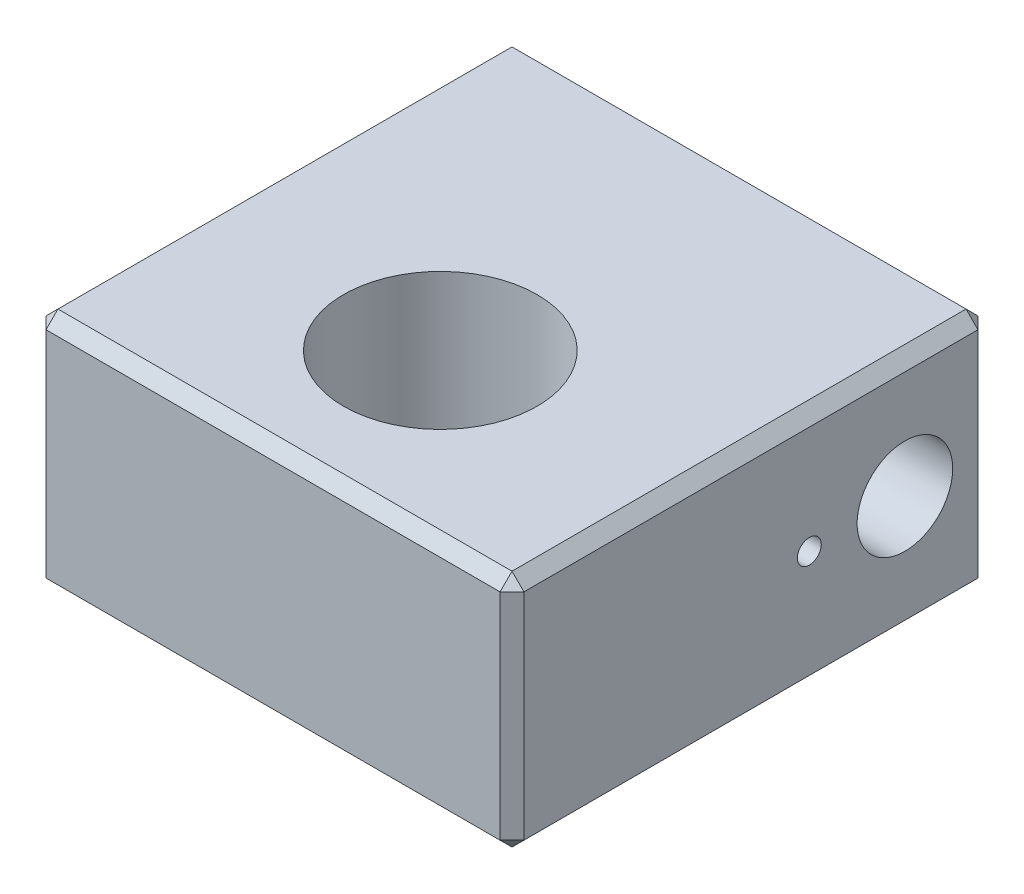
ISO-10303-21;
HEADER;
FILE_DESCRIPTION(('STEP AP214'),'2;1');
FILE_NAME('part.step','',(''),(''),'','','');
FILE_SCHEMA(('AUTOMOTIVE_DESIGN { 1 0 10303 214 1 1 1 1 }'));
ENDSEC;
DATA;
#1=APPLICATION_CONTEXT('core data for automotive mechanical design processes');
#2=APPLICATION_PROTOCOL_DEFINITION('international standard','automotive_design',2000,#1);
#3=PRODUCT_CONTEXT('',#1,'mechanical');
#4=PRODUCT('Part','Part','',(#3));
#5=PRODUCT_RELATED_PRODUCT_CATEGORY('part','',(#4));
#6=PRODUCT_DEFINITION_FORMATION('','',#4);
#7=PRODUCT_DEFINITION_CONTEXT('part definition',#1,'design');
#8=PRODUCT_DEFINITION('design','',#6,#7);
#9=PRODUCT_DEFINITION_SHAPE('','',#8);
#10=(LENGTH_UNIT() NAMED_UNIT(*) SI_UNIT(.MILLI.,.METRE.));
#11=(NAMED_UNIT(*) PLANE_ANGLE_UNIT() SI_UNIT($,.RADIAN.));
#12=(NAMED_UNIT(*) SI_UNIT($,.STERADIAN.) SOLID_ANGLE_UNIT());
#13=UNCERTAINTY_MEASURE_WITH_UNIT(LENGTH_MEASURE(1.E-05),#10,'distance_accuracy_value','');
#14=(GEOMETRIC_REPRESENTATION_CONTEXT(3) GLOBAL_UNCERTAINTY_ASSIGNED_CONTEXT((#13)) GLOBAL_UNIT_ASSIGNED_CONTEXT((#10,
#11,#12)) REPRESENTATION_CONTEXT('',''));
#15=CARTESIAN_POINT('',(0.,0.,0.));
#16=DIRECTION('',(0.,0.,1.));
#17=DIRECTION('',(1.,0.,0.));
#18=AXIS2_PLACEMENT_3D('',#15,#16,#17);
#19=CARTESIAN_POINT('',(10.,5.,-10.));
#20=DIRECTION('',(-1.,0.,0.));
#21=DIRECTION('',(0.,0.,1.));
#22=AXIS2_PLACEMENT_3D('',#19,#20,#21);
#23=PLANE('',#22);
#24=DIRECTION('',(0.,0.,-1.));
#25=VECTOR('',#24,1.);
#26=CARTESIAN_POINT('',(10.,-4.5,-10.));
#27=LINE('',#26,#25);
#28=CARTESIAN_POINT('',(10.,-4.5,9.5));
#29=VERTEX_POINT('',#28);
#30=CARTESIAN_POINT('',(10.,-4.5,-9.49999999999999));
#31=VERTEX_POINT('',#30);
#32=EDGE_CURVE('E180',#29,#31,#27,.T.);
#33=ORIENTED_EDGE('',*,*,#32,.T.);
#34=DIRECTION('',(0.,1.,0.));
#35=VECTOR('',#34,1.);
#36=CARTESIAN_POINT('',(10.,5.,-9.49999999999999));
#37=LINE('',#36,#35);
#38=CARTESIAN_POINT('',(10.,4.5,-9.49999999999999));
#39=VERTEX_POINT('',#38);
#40=EDGE_CURVE('E182',#31,#39,#37,.T.);
#41=ORIENTED_EDGE('',*,*,#40,.T.);
#42=DIRECTION('',(0.,0.,1.));
#43=VECTOR('',#42,1.);
#44=CARTESIAN_POINT('',(10.,4.5,10.));
#45=LINE('',#44,#43);
#46=CARTESIAN_POINT('',(10.,4.5,9.5));
#47=VERTEX_POINT('',#46);
#48=EDGE_CURVE('E176',#39,#47,#45,.T.);
#49=ORIENTED_EDGE('',*,*,#48,.T.);
#50=DIRECTION('',(0.,-1.,0.));
#51=VECTOR('',#50,1.);
#52=CARTESIAN_POINT('',(10.,5.,9.5));
#53=LINE('',#52,#51);
#54=EDGE_CURVE('E178',#47,#29,#53,.T.);
#55=ORIENTED_EDGE('',*,*,#54,.T.);
#56=EDGE_LOOP('',(#33,#41,#49,#55));
#57=FACE_BOUND('',#56,.T.);
#58=CARTESIAN_POINT('',(10.,0.,-2.44209004934981));
#59=DIRECTION('',(1.,0.,0.));
#60=DIRECTION('',(0.,0.,-1.));
#61=AXIS2_PLACEMENT_3D('',#58,#59,#60);
#62=CIRCLE('',#61,0.5);
#63=CARTESIAN_POINT('',(10.,0.,-2.94209004934981));
#64=VERTEX_POINT('',#63);
#65=EDGE_CURVE('E255',#64,#64,#62,.T.);
#66=ORIENTED_EDGE('',*,*,#65,.F.);
#67=EDGE_LOOP('',(#66));
#68=FACE_BOUND('',#67,.T.);
#69=CARTESIAN_POINT('',(10.,0.,-6.44209004934981));
#70=DIRECTION('',(1.,0.,0.));
#71=DIRECTION('',(0.,0.,-1.));
#72=AXIS2_PLACEMENT_3D('',#69,#70,#71);
#73=CIRCLE('',#72,2.);
#74=CARTESIAN_POINT('',(10.,0.,-8.44209004934981));
#75=VERTEX_POINT('',#74);
#76=EDGE_CURVE('E267',#75,#75,#73,.T.);
#77=ORIENTED_EDGE('',*,*,#76,.F.);
#78=EDGE_LOOP('',(#77));
#79=FACE_BOUND('',#78,.T.);
#80=ADVANCED_FACE('F34',(#57,#68,#79),#23,.F.);
#81=CARTESIAN_POINT('',(-10.,5.,-10.));
#82=DIRECTION('',(0.,0.,1.));
#83=DIRECTION('',(1.,0.,0.));
#84=AXIS2_PLACEMENT_3D('',#81,#82,#83);
#85=PLANE('',#84);
#86=DIRECTION('',(-1.,0.,0.));
#87=VECTOR('',#86,1.);
#88=CARTESIAN_POINT('',(-10.,-4.5,-10.));
#89=LINE('',#88,#87);
#90=CARTESIAN_POINT('',(9.5,-4.5,-10.));
#91=VERTEX_POINT('',#90);
#92=CARTESIAN_POINT('',(-9.5,-4.5,-10.));
#93=VERTEX_POINT('',#92);
#94=EDGE_CURVE('E171',#91,#93,#89,.T.);
#95=ORIENTED_EDGE('',*,*,#94,.T.);
#96=DIRECTION('',(0.,1.,0.));
#97=VECTOR('',#96,1.);
#98=CARTESIAN_POINT('',(-9.5,5.,-10.));
#99=LINE('',#98,#97);
#100=CARTESIAN_POINT('',(-9.5,4.5,-10.));
#101=VERTEX_POINT('',#100);
#102=EDGE_CURVE('E173',#93,#101,#99,.T.);
#103=ORIENTED_EDGE('',*,*,#102,.T.);
#104=DIRECTION('',(1.,0.,0.));
#105=VECTOR('',#104,1.);
#106=CARTESIAN_POINT('',(10.,4.5,-10.));
#107=LINE('',#106,#105);
#108=CARTESIAN_POINT('',(9.5,4.5,-10.));
#109=VERTEX_POINT('',#108);
#110=EDGE_CURVE('E167',#101,#109,#107,.T.);
#111=ORIENTED_EDGE('',*,*,#110,.T.);
#112=DIRECTION('',(0.,-1.,0.));
#113=VECTOR('',#112,1.);
#114=CARTESIAN_POINT('',(9.5,5.,-10.));
#115=LINE('',#114,#113);
#116=EDGE_CURVE('E169',#109,#91,#115,.T.);
#117=ORIENTED_EDGE('',*,*,#116,.T.);
#118=EDGE_LOOP('',(#95,#103,#111,#117));
#119=FACE_BOUND('',#118,.T.);
#120=ADVANCED_FACE('F330',(#119),#85,.F.);
#121=CARTESIAN_POINT('',(-10.,5.,-10.));
#122=DIRECTION('',(1.,0.,0.));
#123=DIRECTION('',(0.,0.,-1.));
#124=AXIS2_PLACEMENT_3D('',#121,#122,#123);
#125=PLANE('',#124);
#126=DIRECTION('',(0.,-1.,0.));
#127=VECTOR('',#126,1.);
#128=CARTESIAN_POINT('',(-10.,5.,-9.5));
#129=LINE('',#128,#127);
#130=CARTESIAN_POINT('',(-10.,4.5,-9.5));
#131=VERTEX_POINT('',#130);
#132=CARTESIAN_POINT('',(-10.,-4.5,-9.5));
#133=VERTEX_POINT('',#132);
#134=EDGE_CURVE('E154',#131,#133,#129,.T.);
#135=ORIENTED_EDGE('',*,*,#134,.T.);
#136=DIRECTION('',(0.,0.,1.));
#137=VECTOR('',#136,1.);
#138=CARTESIAN_POINT('',(-10.,-4.5,-10.));
#139=LINE('',#138,#137);
#140=CARTESIAN_POINT('',(-10.,-4.5,9.5));
#141=VERTEX_POINT('',#140);
#142=EDGE_CURVE('E129',#133,#141,#139,.T.);
#143=ORIENTED_EDGE('',*,*,#142,.T.);
#144=DIRECTION('',(0.,1.,0.));
#145=VECTOR('',#144,1.);
#146=CARTESIAN_POINT('',(-10.,5.,9.5));
#147=LINE('',#146,#145);
#148=CARTESIAN_POINT('',(-10.,4.5,9.5));
#149=VERTEX_POINT('',#148);
#150=EDGE_CURVE('E142',#141,#149,#147,.T.);
#151=ORIENTED_EDGE('',*,*,#150,.T.);
#152=DIRECTION('',(0.,0.,-1.));
#153=VECTOR('',#152,1.);
#154=CARTESIAN_POINT('',(-10.,4.5,-10.));
#155=LINE('',#154,#153);
#156=EDGE_CURVE('E148',#149,#131,#155,.T.);
#157=ORIENTED_EDGE('',*,*,#156,.T.);
#158=EDGE_LOOP('',(#135,#143,#151,#157));
#159=FACE_BOUND('',#158,.T.);
#160=CARTESIAN_POINT('',(-10.,0.,-6.44209004934981));
#161=DIRECTION('',(1.,0.,0.));
#162=DIRECTION('',(0.,0.,-1.));
#163=AXIS2_PLACEMENT_3D('',#160,#161,#162);
#164=CIRCLE('',#163,2.);
#165=CARTESIAN_POINT('',(-10.,0.,-8.44209004934981));
#166=VERTEX_POINT('',#165);
#167=EDGE_CURVE('E270',#166,#166,#164,.T.);
#168=ORIENTED_EDGE('',*,*,#167,.T.);
#169=EDGE_LOOP('',(#168));
#170=FACE_BOUND('',#169,.T.);
#171=ADVANCED_FACE('F151',(#159,#170),#125,.F.);
#172=CARTESIAN_POINT('',(-10.,5.,10.));
#173=DIRECTION('',(0.,0.,-1.));
#174=DIRECTION('',(-1.,0.,0.));
#175=AXIS2_PLACEMENT_3D('',#172,#173,#174);
#176=PLANE('',#175);
#177=DIRECTION('',(-1.,0.,0.));
#178=VECTOR('',#177,1.);
#179=CARTESIAN_POINT('',(-10.,4.5,10.));
#180=LINE('',#179,#178);
#181=CARTESIAN_POINT('',(9.5,4.5,10.));
#182=VERTEX_POINT('',#181);
#183=CARTESIAN_POINT('',(-9.5,4.5,10.));
#184=VERTEX_POINT('',#183);
#185=EDGE_CURVE('E194',#182,#184,#180,.T.);
#186=ORIENTED_EDGE('',*,*,#185,.T.);
#187=DIRECTION('',(0.,-1.,0.));
#188=VECTOR('',#187,1.);
#189=CARTESIAN_POINT('',(-9.5,5.,10.));
#190=LINE('',#189,#188);
#191=CARTESIAN_POINT('',(-9.5,-4.5,10.));
#192=VERTEX_POINT('',#191);
#193=EDGE_CURVE('E11',#184,#192,#190,.T.);
#194=ORIENTED_EDGE('',*,*,#193,.T.);
#195=DIRECTION('',(1.,0.,0.));
#196=VECTOR('',#195,1.);
#197=CARTESIAN_POINT('',(-10.,-4.5,10.));
#198=LINE('',#197,#196);
#199=CARTESIAN_POINT('',(9.5,-4.5,10.));
#200=VERTEX_POINT('',#199);
#201=EDGE_CURVE('E43',#192,#200,#198,.T.);
#202=ORIENTED_EDGE('',*,*,#201,.T.);
#203=DIRECTION('',(0.,1.,0.));
#204=VECTOR('',#203,1.);
#205=CARTESIAN_POINT('',(9.5,5.,10.));
#206=LINE('',#205,#204);
#207=EDGE_CURVE('E196',#200,#182,#206,.T.);
#208=ORIENTED_EDGE('',*,*,#207,.T.);
#209=EDGE_LOOP('',(#186,#194,#202,#208));
#210=FACE_BOUND('',#209,.T.);
#211=ADVANCED_FACE('F310',(#210),#176,.F.);
#212=CARTESIAN_POINT('',(0.,5.,0.));
#213=DIRECTION('',(0.,1.,0.));
#214=DIRECTION('',(0.,0.,1.));
#215=AXIS2_PLACEMENT_3D('',#212,#213,#214);
#216=PLANE('',#215);
#217=DIRECTION('',(0.,0.,-1.));
#218=VECTOR('',#217,1.);
#219=CARTESIAN_POINT('',(9.5,5.,-10.));
#220=LINE('',#219,#218);
#221=CARTESIAN_POINT('',(9.5,5.,9.5));
#222=VERTEX_POINT('',#221);
#223=CARTESIAN_POINT('',(9.5,5.,-9.5));
#224=VERTEX_POINT('',#223);
#225=EDGE_CURVE('E185',#222,#224,#220,.T.);
#226=ORIENTED_EDGE('',*,*,#225,.T.);
#227=DIRECTION('',(-1.,0.,0.));
#228=VECTOR('',#227,1.);
#229=CARTESIAN_POINT('',(-10.,5.,-9.5));
#230=LINE('',#229,#228);
#231=CARTESIAN_POINT('',(-9.5,5.,-9.5));
#232=VERTEX_POINT('',#231);
#233=EDGE_CURVE('E191',#224,#232,#230,.T.);
#234=ORIENTED_EDGE('',*,*,#233,.T.);
#235=DIRECTION('',(0.,0.,1.));
#236=VECTOR('',#235,1.);
#237=CARTESIAN_POINT('',(-9.5,5.,10.));
#238=LINE('',#237,#236);
#239=CARTESIAN_POINT('',(-9.5,5.,9.5));
#240=VERTEX_POINT('',#239);
#241=EDGE_CURVE('E189',#232,#240,#238,.T.);
#242=ORIENTED_EDGE('',*,*,#241,.T.);
#243=DIRECTION('',(1.,0.,0.));
#244=VECTOR('',#243,1.);
#245=CARTESIAN_POINT('',(10.,5.,9.5));
#246=LINE('',#245,#244);
#247=EDGE_CURVE('E187',#240,#222,#246,.T.);
#248=ORIENTED_EDGE('',*,*,#247,.T.);
#249=EDGE_LOOP('',(#226,#234,#242,#248));
#250=FACE_BOUND('',#249,.T.);
#251=CARTESIAN_POINT('',(0.,5.,3.));
#252=DIRECTION('',(0.,1.,0.));
#253=DIRECTION('',(0.,0.,1.));
#254=AXIS2_PLACEMENT_3D('',#251,#252,#253);
#255=CIRCLE('',#254,4.05);
#256=CARTESIAN_POINT('',(0.,5.,7.05));
#257=VERTEX_POINT('',#256);
#258=EDGE_CURVE('E273',#257,#257,#255,.T.);
#259=ORIENTED_EDGE('',*,*,#258,.F.);
#260=EDGE_LOOP('',(#259));
#261=FACE_BOUND('',#260,.T.);
#262=ADVANCED_FACE('F533',(#250,#261),#216,.T.);
#263=CARTESIAN_POINT('',(0.,-5.,0.));
#264=DIRECTION('',(0.,1.,0.));
#265=DIRECTION('',(0.,0.,1.));
#266=AXIS2_PLACEMENT_3D('',#263,#264,#265);
#267=PLANE('',#266);
#268=DIRECTION('',(-1.,0.,0.));
#269=VECTOR('',#268,1.);
#270=CARTESIAN_POINT('',(0.,-5.,9.5));
#271=LINE('',#270,#269);
#272=CARTESIAN_POINT('',(9.5,-5.,9.5));
#273=VERTEX_POINT('',#272);
#274=CARTESIAN_POINT('',(-9.49999999999999,-5.,9.5));
#275=VERTEX_POINT('',#274);
#276=EDGE_CURVE('E158',#273,#275,#271,.T.);
#277=ORIENTED_EDGE('',*,*,#276,.T.);
#278=DIRECTION('',(0.,0.,-1.));
#279=VECTOR('',#278,1.);
#280=CARTESIAN_POINT('',(-9.5,-5.,0.));
#281=LINE('',#280,#279);
#282=CARTESIAN_POINT('',(-9.5,-5.,-9.49999999999999));
#283=VERTEX_POINT('',#282);
#284=EDGE_CURVE('E131',#275,#283,#281,.T.);
#285=ORIENTED_EDGE('',*,*,#284,.T.);
#286=DIRECTION('',(1.,0.,0.));
#287=VECTOR('',#286,1.);
#288=CARTESIAN_POINT('',(0.,-5.,-9.49999999999999));
#289=LINE('',#288,#287);
#290=CARTESIAN_POINT('',(9.5,-5.,-9.49999999999999));
#291=VERTEX_POINT('',#290);
#292=EDGE_CURVE('E164',#283,#291,#289,.T.);
#293=ORIENTED_EDGE('',*,*,#292,.T.);
#294=DIRECTION('',(0.,0.,1.));
#295=VECTOR('',#294,1.);
#296=CARTESIAN_POINT('',(9.5,-5.,0.));
#297=LINE('',#296,#295);
#298=EDGE_CURVE('E156',#291,#273,#297,.T.);
#299=ORIENTED_EDGE('',*,*,#298,.T.);
#300=EDGE_LOOP('',(#277,#285,#293,#299));
#301=FACE_BOUND('',#300,.T.);
#302=CARTESIAN_POINT('',(0.,-5.,3.));
#303=DIRECTION('',(0.,1.,0.));
#304=DIRECTION('',(0.,0.,1.));
#305=AXIS2_PLACEMENT_3D('',#302,#303,#304);
#306=CIRCLE('',#305,4.05);
#307=CARTESIAN_POINT('',(0.,-5.,7.05));
#308=VERTEX_POINT('',#307);
#309=EDGE_CURVE('E149',#308,#308,#306,.T.);
#310=ORIENTED_EDGE('',*,*,#309,.T.);
#311=EDGE_LOOP('',(#310));
#312=FACE_BOUND('',#311,.T.);
#313=ADVANCED_FACE('F303',(#301,#312),#267,.F.);
#314=CARTESIAN_POINT('',(0.,-5.,3.));
#315=DIRECTION('',(0.,1.,0.));
#316=DIRECTION('',(0.,0.,1.));
#317=AXIS2_PLACEMENT_3D('',#314,#315,#316);
#318=CYLINDRICAL_SURFACE('',#317,4.05);
#319=ORIENTED_EDGE('',*,*,#309,.F.);
#320=EDGE_LOOP('',(#319));
#321=FACE_BOUND('',#320,.T.);
#322=ORIENTED_EDGE('',*,*,#258,.T.);
#323=EDGE_LOOP('',(#322));
#324=FACE_BOUND('',#323,.T.);
#325=ADVANCED_FACE('F517',(#321,#324),#318,.F.);
#326=CARTESIAN_POINT('',(-10.,0.,-6.44209004934981));
#327=DIRECTION('',(1.,0.,0.));
#328=DIRECTION('',(0.,0.,-1.));
#329=AXIS2_PLACEMENT_3D('',#326,#327,#328);
#330=CYLINDRICAL_SURFACE('',#329,2.);
#331=ORIENTED_EDGE('',*,*,#167,.F.);
#332=EDGE_LOOP('',(#331));
#333=FACE_BOUND('',#332,.T.);
#334=ORIENTED_EDGE('',*,*,#76,.T.);
#335=EDGE_LOOP('',(#334));
#336=FACE_BOUND('',#335,.T.);
#337=ADVANCED_FACE('F508',(#333,#336),#330,.F.);
#338=CARTESIAN_POINT('',(0.,0.,-2.44209004934981));
#339=DIRECTION('',(1.,0.,0.));
#340=DIRECTION('',(0.,0.,-1.));
#341=AXIS2_PLACEMENT_3D('',#338,#339,#340);
#342=CYLINDRICAL_SURFACE('',#341,0.5);
#343=CARTESIAN_POINT('',(0.,0.,-2.44209004934981));
#344=DIRECTION('',(1.,0.,0.));
#345=DIRECTION('',(0.,0.,-1.));
#346=AXIS2_PLACEMENT_3D('',#343,#344,#345);
#347=CIRCLE('',#346,0.5);
#348=CARTESIAN_POINT('',(0.,0.,-2.94209004934981));
#349=VERTEX_POINT('',#348);
#350=EDGE_CURVE('E262',#349,#349,#347,.T.);
#351=ORIENTED_EDGE('',*,*,#350,.F.);
#352=EDGE_LOOP('',(#351));
#353=FACE_BOUND('',#352,.T.);
#354=ORIENTED_EDGE('',*,*,#65,.T.);
#355=EDGE_LOOP('',(#354));
#356=FACE_BOUND('',#355,.T.);
#357=ADVANCED_FACE('F499',(#353,#356),#342,.F.);
#358=CARTESIAN_POINT('',(0.,0.,-2.44209004934981));
#359=DIRECTION('',(1.,0.,0.));
#360=DIRECTION('',(0.,0.,-1.));
#361=AXIS2_PLACEMENT_3D('',#358,#359,#360);
#362=PLANE('',#361);
#363=ORIENTED_EDGE('',*,*,#350,.T.);
#364=EDGE_LOOP('',(#363));
#365=FACE_BOUND('',#364,.T.);
#366=ADVANCED_FACE('F490',(#365),#362,.T.);
#367=CARTESIAN_POINT('',(9.5,5.,0.));
#368=DIRECTION('',(0.70710678118655,0.707106781186545,0.));
#369=DIRECTION('',(0.,0.,1.));
#370=AXIS2_PLACEMENT_3D('',#367,#368,#369);
#371=PLANE('',#370);
#372=DIRECTION('',(0.707106781186545,-0.70710678118655,0.));
#373=VECTOR('',#372,1.);
#374=CARTESIAN_POINT('',(10.,4.5,-9.49999999999999));
#375=LINE('',#374,#373);
#376=EDGE_CURVE('E38',#224,#39,#375,.T.);
#377=ORIENTED_EDGE('',*,*,#376,.F.);
#378=ORIENTED_EDGE('',*,*,#225,.F.);
#379=DIRECTION('',(-0.707106781186545,0.70710678118655,0.));
#380=VECTOR('',#379,1.);
#381=CARTESIAN_POINT('',(9.75,4.75,9.5));
#382=LINE('',#381,#380);
#383=EDGE_CURVE('E248',#47,#222,#382,.T.);
#384=ORIENTED_EDGE('',*,*,#383,.F.);
#385=ORIENTED_EDGE('',*,*,#48,.F.);
#386=EDGE_LOOP('',(#377,#378,#384,#385));
#387=FACE_BOUND('',#386,.T.);
#388=ADVANCED_FACE('F36',(#387),#371,.T.);
#389=CARTESIAN_POINT('',(10.,4.5,-9.49999999999999));
#390=DIRECTION('',(0.57735026918963,0.577350269189622,-0.577350269189626));
#391=DIRECTION('',(-0.707106781186545,0.,-0.70710678118655));
#392=AXIS2_PLACEMENT_3D('',#389,#390,#391);
#393=PLANE('',#392);
#394=DIRECTION('',(0.,0.70710678118655,0.707106781186545));
#395=VECTOR('',#394,1.);
#396=CARTESIAN_POINT('',(9.5,4.75,-9.75));
#397=LINE('',#396,#395);
#398=EDGE_CURVE('E244',#224,#109,#397,.F.);
#399=ORIENTED_EDGE('',*,*,#398,.F.);
#400=ORIENTED_EDGE('',*,*,#376,.T.);
#401=DIRECTION('',(0.707106781186545,0.,0.70710678118655));
#402=VECTOR('',#401,1.);
#403=CARTESIAN_POINT('',(10.,4.5,-9.49999999999999));
#404=LINE('',#403,#402);
#405=EDGE_CURVE('E247',#109,#39,#404,.T.);
#406=ORIENTED_EDGE('',*,*,#405,.F.);
#407=EDGE_LOOP('',(#399,#400,#406));
#408=FACE_BOUND('',#407,.T.);
#409=ADVANCED_FACE('F476',(#408),#393,.T.);
#410=CARTESIAN_POINT('',(9.5,4.5,10.));
#411=DIRECTION('',(0.577350269189629,0.577350269189621,0.577350269189627));
#412=DIRECTION('',(0.707106781186546,0.,-0.707106781186549));
#413=AXIS2_PLACEMENT_3D('',#410,#411,#412);
#414=PLANE('',#413);
#415=DIRECTION('',(-0.707106781186546,0.,0.707106781186549));
#416=VECTOR('',#415,1.);
#417=CARTESIAN_POINT('',(9.5,4.5,10.));
#418=LINE('',#417,#416);
#419=EDGE_CURVE('E238',#47,#182,#418,.T.);
#420=ORIENTED_EDGE('',*,*,#419,.F.);
#421=ORIENTED_EDGE('',*,*,#383,.T.);
#422=DIRECTION('',(0.,-0.70710678118655,0.707106781186545));
#423=VECTOR('',#422,1.);
#424=CARTESIAN_POINT('',(9.5,4.5,10.));
#425=LINE('',#424,#423);
#426=EDGE_CURVE('E241',#182,#222,#425,.F.);
#427=ORIENTED_EDGE('',*,*,#426,.F.);
#428=EDGE_LOOP('',(#420,#421,#427));
#429=FACE_BOUND('',#428,.T.);
#430=ADVANCED_FACE('F467',(#429),#414,.T.);
#431=CARTESIAN_POINT('',(9.5,5.,-10.));
#432=DIRECTION('',(-0.70710678118655,0.,0.707106781186545));
#433=DIRECTION('',(0.,-1.,0.));
#434=AXIS2_PLACEMENT_3D('',#431,#432,#433);
#435=PLANE('',#434);
#436=ORIENTED_EDGE('',*,*,#405,.T.);
#437=ORIENTED_EDGE('',*,*,#40,.F.);
#438=DIRECTION('',(-0.707106781186545,0.,-0.70710678118655));
#439=VECTOR('',#438,1.);
#440=CARTESIAN_POINT('',(9.75,-4.5,-9.75));
#441=LINE('',#440,#439);
#442=EDGE_CURVE('E232',#91,#31,#441,.F.);
#443=ORIENTED_EDGE('',*,*,#442,.F.);
#444=ORIENTED_EDGE('',*,*,#116,.F.);
#445=EDGE_LOOP('',(#436,#437,#443,#444));
#446=FACE_BOUND('',#445,.T.);
#447=ADVANCED_FACE('F458',(#446),#435,.F.);
#448=CARTESIAN_POINT('',(0.,5.,-9.5));
#449=DIRECTION('',(0.,0.707106781186545,-0.70710678118655));
#450=DIRECTION('',(1.,0.,0.));
#451=AXIS2_PLACEMENT_3D('',#448,#449,#450);
#452=PLANE('',#451);
#453=ORIENTED_EDGE('',*,*,#398,.T.);
#454=ORIENTED_EDGE('',*,*,#110,.F.);
#455=DIRECTION('',(0.,-0.70710678118655,-0.707106781186545));
#456=VECTOR('',#455,1.);
#457=CARTESIAN_POINT('',(-9.5,4.5,-10.));
#458=LINE('',#457,#456);
#459=EDGE_CURVE('E229',#232,#101,#458,.T.);
#460=ORIENTED_EDGE('',*,*,#459,.F.);
#461=ORIENTED_EDGE('',*,*,#233,.F.);
#462=EDGE_LOOP('',(#453,#454,#460,#461));
#463=FACE_BOUND('',#462,.T.);
#464=ADVANCED_FACE('F450',(#463),#452,.T.);
#465=CARTESIAN_POINT('',(-9.5,5.,0.));
#466=DIRECTION('',(-0.707106781186549,0.707106781186546,0.));
#467=DIRECTION('',(0.,0.,-1.));
#468=AXIS2_PLACEMENT_3D('',#465,#466,#467);
#469=PLANE('',#468);
#470=DIRECTION('',(-0.707106781186546,-0.707106781186549,0.));
#471=VECTOR('',#470,1.);
#472=CARTESIAN_POINT('',(-9.5,5.,9.5));
#473=LINE('',#472,#471);
#474=EDGE_CURVE('E224',#240,#149,#473,.T.);
#475=ORIENTED_EDGE('',*,*,#474,.F.);
#476=ORIENTED_EDGE('',*,*,#241,.F.);
#477=DIRECTION('',(0.707106781186546,0.707106781186549,0.));
#478=VECTOR('',#477,1.);
#479=CARTESIAN_POINT('',(-9.75,4.75,-9.5));
#480=LINE('',#479,#478);
#481=EDGE_CURVE('E227',#131,#232,#480,.T.);
#482=ORIENTED_EDGE('',*,*,#481,.F.);
#483=ORIENTED_EDGE('',*,*,#156,.F.);
#484=EDGE_LOOP('',(#475,#476,#482,#483));
#485=FACE_BOUND('',#484,.T.);
#486=ADVANCED_FACE('F284',(#485),#469,.T.);
#487=CARTESIAN_POINT('',(0.,5.,9.5));
#488=DIRECTION('',(0.,0.707106781186545,0.70710678118655));
#489=DIRECTION('',(-1.,0.,0.));
#490=AXIS2_PLACEMENT_3D('',#487,#488,#489);
#491=PLANE('',#490);
#492=ORIENTED_EDGE('',*,*,#426,.T.);
#493=ORIENTED_EDGE('',*,*,#247,.F.);
#494=DIRECTION('',(0.,0.70710678118655,-0.707106781186545));
#495=VECTOR('',#494,1.);
#496=CARTESIAN_POINT('',(-9.5,5.,9.5));
#497=LINE('',#496,#495);
#498=EDGE_CURVE('E221',#184,#240,#497,.T.);
#499=ORIENTED_EDGE('',*,*,#498,.F.);
#500=ORIENTED_EDGE('',*,*,#185,.F.);
#501=EDGE_LOOP('',(#492,#493,#499,#500));
#502=FACE_BOUND('',#501,.T.);
#503=ADVANCED_FACE('F315',(#502),#491,.T.);
#504=CARTESIAN_POINT('',(10.,5.,9.5));
#505=DIRECTION('',(-0.707106781186549,0.,-0.707106781186546));
#506=DIRECTION('',(0.,-1.,0.));
#507=AXIS2_PLACEMENT_3D('',#504,#505,#506);
#508=PLANE('',#507);
#509=ORIENTED_EDGE('',*,*,#419,.T.);
#510=ORIENTED_EDGE('',*,*,#207,.F.);
#511=DIRECTION('',(0.707106781186546,0.,-0.707106781186549));
#512=VECTOR('',#511,1.);
#513=CARTESIAN_POINT('',(9.5,-4.5,10.));
#514=LINE('',#513,#512);
#515=EDGE_CURVE('E218',#29,#200,#514,.F.);
#516=ORIENTED_EDGE('',*,*,#515,.F.);
#517=ORIENTED_EDGE('',*,*,#54,.F.);
#518=EDGE_LOOP('',(#509,#510,#516,#517));
#519=FACE_BOUND('',#518,.T.);
#520=ADVANCED_FACE('F426',(#519),#508,.F.);
#521=CARTESIAN_POINT('',(10.,-4.5,-10.));
#522=DIRECTION('',(-0.70710678118655,0.707106781186545,0.));
#523=DIRECTION('',(0.,0.,-1.));
#524=AXIS2_PLACEMENT_3D('',#521,#522,#523);
#525=PLANE('',#524);
#526=DIRECTION('',(0.707106781186545,0.70710678118655,0.));
#527=VECTOR('',#526,1.);
#528=CARTESIAN_POINT('',(9.5,-5.,-9.49999999999999));
#529=LINE('',#528,#527);
#530=EDGE_CURVE('E235',#31,#291,#529,.F.);
#531=ORIENTED_EDGE('',*,*,#530,.F.);
#532=ORIENTED_EDGE('',*,*,#32,.F.);
#533=DIRECTION('',(-0.707106781186545,-0.70710678118655,0.));
#534=VECTOR('',#533,1.);
#535=CARTESIAN_POINT('',(9.75,-4.75,9.5));
#536=LINE('',#535,#534);
#537=EDGE_CURVE('E215',#273,#29,#536,.F.);
#538=ORIENTED_EDGE('',*,*,#537,.F.);
#539=ORIENTED_EDGE('',*,*,#298,.F.);
#540=EDGE_LOOP('',(#531,#532,#538,#539));
#541=FACE_BOUND('',#540,.T.);
#542=ADVANCED_FACE('F417',(#541),#525,.F.);
#543=CARTESIAN_POINT('',(9.5,-5.,-9.49999999999999));
#544=DIRECTION('',(0.57735026918963,-0.577350269189626,-0.577350269189622));
#545=DIRECTION('',(0.707106781186545,0.70710678118655,0.));
#546=AXIS2_PLACEMENT_3D('',#543,#544,#545);
#547=PLANE('',#546);
#548=ORIENTED_EDGE('',*,*,#442,.T.);
#549=ORIENTED_EDGE('',*,*,#530,.T.);
#550=DIRECTION('',(0.,-0.707106781186545,0.70710678118655));
#551=VECTOR('',#550,1.);
#552=CARTESIAN_POINT('',(9.5,-5.,-9.49999999999999));
#553=LINE('',#552,#551);
#554=EDGE_CURVE('E212',#91,#291,#553,.T.);
#555=ORIENTED_EDGE('',*,*,#554,.F.);
#556=EDGE_LOOP('',(#548,#549,#555));
#557=FACE_BOUND('',#556,.T.);
#558=ADVANCED_FACE('F327',(#557),#547,.T.);
#559=CARTESIAN_POINT('',(-9.5,4.5,-10.));
#560=DIRECTION('',(-0.577350269189625,0.577350269189623,-0.577350269189629));
#561=DIRECTION('',(-0.70710678118655,0.,0.707106781186545));
#562=AXIS2_PLACEMENT_3D('',#559,#560,#561);
#563=PLANE('',#562);
#564=ORIENTED_EDGE('',*,*,#481,.T.);
#565=ORIENTED_EDGE('',*,*,#459,.T.);
#566=DIRECTION('',(0.70710678118655,0.,-0.707106781186545));
#567=VECTOR('',#566,1.);
#568=CARTESIAN_POINT('',(-9.5,4.5,-10.));
#569=LINE('',#568,#567);
#570=EDGE_CURVE('E210',#131,#101,#569,.T.);
#571=ORIENTED_EDGE('',*,*,#570,.F.);
#572=EDGE_LOOP('',(#564,#565,#571));
#573=FACE_BOUND('',#572,.T.);
#574=ADVANCED_FACE('F287',(#573),#563,.T.);
#575=CARTESIAN_POINT('',(-9.5,5.,9.5));
#576=DIRECTION('',(-0.577350269189629,0.577350269189623,0.577350269189625));
#577=DIRECTION('',(0.707106781186545,0.,0.70710678118655));
#578=AXIS2_PLACEMENT_3D('',#575,#576,#577);
#579=PLANE('',#578);
#580=ORIENTED_EDGE('',*,*,#498,.T.);
#581=ORIENTED_EDGE('',*,*,#474,.T.);
#582=DIRECTION('',(-0.707106781186545,0.,-0.70710678118655));
#583=VECTOR('',#582,1.);
#584=CARTESIAN_POINT('',(-9.75,4.5,9.75));
#585=LINE('',#584,#583);
#586=EDGE_CURVE('E145',#184,#149,#585,.T.);
#587=ORIENTED_EDGE('',*,*,#586,.F.);
#588=EDGE_LOOP('',(#580,#581,#587));
#589=FACE_BOUND('',#588,.T.);
#590=ADVANCED_FACE('F317',(#589),#579,.T.);
#591=CARTESIAN_POINT('',(9.5,-4.5,10.));
#592=DIRECTION('',(0.577350269189629,-0.577350269189625,0.577350269189623));
#593=DIRECTION('',(0.707106781186545,0.70710678118655,0.));
#594=AXIS2_PLACEMENT_3D('',#591,#592,#593);
#595=PLANE('',#594);
#596=ORIENTED_EDGE('',*,*,#537,.T.);
#597=ORIENTED_EDGE('',*,*,#515,.T.);
#598=DIRECTION('',(0.,0.707106781186545,0.70710678118655));
#599=VECTOR('',#598,1.);
#600=CARTESIAN_POINT('',(9.5,-4.5,10.));
#601=LINE('',#600,#599);
#602=EDGE_CURVE('E206',#273,#200,#601,.T.);
#603=ORIENTED_EDGE('',*,*,#602,.F.);
#604=EDGE_LOOP('',(#596,#597,#603));
#605=FACE_BOUND('',#604,.T.);
#606=ADVANCED_FACE('F319',(#605),#595,.T.);
#607=CARTESIAN_POINT('',(-10.,-4.5,-10.));
#608=DIRECTION('',(0.,0.70710678118655,0.707106781186545));
#609=DIRECTION('',(-1.,0.,0.));
#610=AXIS2_PLACEMENT_3D('',#607,#608,#609);
#611=PLANE('',#610);
#612=ORIENTED_EDGE('',*,*,#554,.T.);
#613=ORIENTED_EDGE('',*,*,#292,.F.);
#614=DIRECTION('',(0.,0.707106781186545,-0.70710678118655));
#615=VECTOR('',#614,1.);
#616=CARTESIAN_POINT('',(-9.5,-5.,-9.49999999999999));
#617=LINE('',#616,#615);
#618=EDGE_CURVE('E203',#93,#283,#617,.F.);
#619=ORIENTED_EDGE('',*,*,#618,.F.);
#620=ORIENTED_EDGE('',*,*,#94,.F.);
#621=EDGE_LOOP('',(#612,#613,#619,#620));
#622=FACE_BOUND('',#621,.T.);
#623=ADVANCED_FACE('F299',(#622),#611,.F.);
#624=CARTESIAN_POINT('',(-10.,5.,-9.5));
#625=DIRECTION('',(0.707106781186545,0.,0.70710678118655));
#626=DIRECTION('',(0.,-1.,0.));
#627=AXIS2_PLACEMENT_3D('',#624,#625,#626);
#628=PLANE('',#627);
#629=ORIENTED_EDGE('',*,*,#570,.T.);
#630=ORIENTED_EDGE('',*,*,#102,.F.);
#631=DIRECTION('',(-0.70710678118655,0.,0.707106781186545));
#632=VECTOR('',#631,1.);
#633=CARTESIAN_POINT('',(-9.75,-4.5,-9.75));
#634=LINE('',#633,#632);
#635=EDGE_CURVE('E139',#133,#93,#634,.F.);
#636=ORIENTED_EDGE('',*,*,#635,.F.);
#637=ORIENTED_EDGE('',*,*,#134,.F.);
#638=EDGE_LOOP('',(#629,#630,#636,#637));
#639=FACE_BOUND('',#638,.T.);
#640=ADVANCED_FACE('F291',(#639),#628,.F.);
#641=CARTESIAN_POINT('',(-9.5,5.,10.));
#642=DIRECTION('',(0.70710678118655,0.,-0.707106781186545));
#643=DIRECTION('',(0.,-1.,0.));
#644=AXIS2_PLACEMENT_3D('',#641,#642,#643);
#645=PLANE('',#644);
#646=ORIENTED_EDGE('',*,*,#586,.T.);
#647=ORIENTED_EDGE('',*,*,#150,.F.);
#648=DIRECTION('',(0.707106781186545,0.,0.70710678118655));
#649=VECTOR('',#648,1.);
#650=CARTESIAN_POINT('',(-10.,-4.5,9.5));
#651=LINE('',#650,#649);
#652=EDGE_CURVE('E134',#192,#141,#651,.F.);
#653=ORIENTED_EDGE('',*,*,#652,.F.);
#654=ORIENTED_EDGE('',*,*,#193,.F.);
#655=EDGE_LOOP('',(#646,#647,#653,#654));
#656=FACE_BOUND('',#655,.T.);
#657=ADVANCED_FACE('F143',(#656),#645,.F.);
#658=CARTESIAN_POINT('',(-10.,-4.5,10.));
#659=DIRECTION('',(0.,0.70710678118655,-0.707106781186545));
#660=DIRECTION('',(1.,0.,0.));
#661=AXIS2_PLACEMENT_3D('',#658,#659,#660);
#662=PLANE('',#661);
#663=ORIENTED_EDGE('',*,*,#602,.T.);
#664=ORIENTED_EDGE('',*,*,#201,.F.);
#665=DIRECTION('',(0.,-0.707106781186545,-0.70710678118655));
#666=VECTOR('',#665,1.);
#667=CARTESIAN_POINT('',(-9.5,-4.75,9.75));
#668=LINE('',#667,#666);
#669=EDGE_CURVE('E51',#275,#192,#668,.F.);
#670=ORIENTED_EDGE('',*,*,#669,.F.);
#671=ORIENTED_EDGE('',*,*,#276,.F.);
#672=EDGE_LOOP('',(#663,#664,#670,#671));
#673=FACE_BOUND('',#672,.T.);
#674=ADVANCED_FACE('F308',(#673),#662,.F.);
#675=CARTESIAN_POINT('',(-9.5,-5.,-9.49999999999999));
#676=DIRECTION('',(-0.577350269189622,-0.57735026918963,-0.577350269189626));
#677=DIRECTION('',(0.,0.707106781186545,-0.70710678118655));
#678=AXIS2_PLACEMENT_3D('',#675,#676,#677);
#679=PLANE('',#678);
#680=ORIENTED_EDGE('',*,*,#635,.T.);
#681=ORIENTED_EDGE('',*,*,#618,.T.);
#682=DIRECTION('',(0.707106781186551,-0.707106781186545,0.));
#683=VECTOR('',#682,1.);
#684=CARTESIAN_POINT('',(-9.5,-5.,-9.49999999999999));
#685=LINE('',#684,#683);
#686=EDGE_CURVE('E132',#133,#283,#685,.T.);
#687=ORIENTED_EDGE('',*,*,#686,.F.);
#688=EDGE_LOOP('',(#680,#681,#687));
#689=FACE_BOUND('',#688,.T.);
#690=ADVANCED_FACE('F295',(#689),#679,.T.);
#691=CARTESIAN_POINT('',(-10.,-4.5,9.5));
#692=DIRECTION('',(-0.577350269189626,-0.57735026918963,0.577350269189622));
#693=DIRECTION('',(0.70710678118655,-0.707106781186545,0.));
#694=AXIS2_PLACEMENT_3D('',#691,#692,#693);
#695=PLANE('',#694);
#696=ORIENTED_EDGE('',*,*,#669,.T.);
#697=ORIENTED_EDGE('',*,*,#652,.T.);
#698=DIRECTION('',(-0.707106781186551,0.707106781186544,0.));
#699=VECTOR('',#698,1.);
#700=CARTESIAN_POINT('',(-10.,-4.5,9.5));
#701=LINE('',#700,#699);
#702=EDGE_CURVE('E126',#275,#141,#701,.T.);
#703=ORIENTED_EDGE('',*,*,#702,.F.);
#704=EDGE_LOOP('',(#696,#697,#703));
#705=FACE_BOUND('',#704,.T.);
#706=ADVANCED_FACE('F136',(#705),#695,.T.);
#707=CARTESIAN_POINT('',(-10.,-4.5,-10.));
#708=DIRECTION('',(0.707106781186544,0.707106781186551,0.));
#709=DIRECTION('',(0.,0.,1.));
#710=AXIS2_PLACEMENT_3D('',#707,#708,#709);
#711=PLANE('',#710);
#712=ORIENTED_EDGE('',*,*,#686,.T.);
#713=ORIENTED_EDGE('',*,*,#284,.F.);
#714=ORIENTED_EDGE('',*,*,#702,.T.);
#715=ORIENTED_EDGE('',*,*,#142,.F.);
#716=EDGE_LOOP('',(#712,#713,#714,#715));
#717=FACE_BOUND('',#716,.T.);
#718=ADVANCED_FACE('F127',(#717),#711,.F.);
#719=CLOSED_SHELL('',(#80,#120,#171,#211,#262,#313,#325,#337,#357,#366,#388,#409,#430,#447,#464,
#486,#503,#520,#542,#558,#574,#590,#606,#623,#640,#657,#674,#690,#706,#718));
#720=MANIFOLD_SOLID_BREP('B2',#719);
#721=ADVANCED_BREP_SHAPE_REPRESENTATION('',(#18,#720),#14);
#722=SHAPE_DEFINITION_REPRESENTATION(#9,#721);
ENDSEC;
END-ISO-10303-21;
